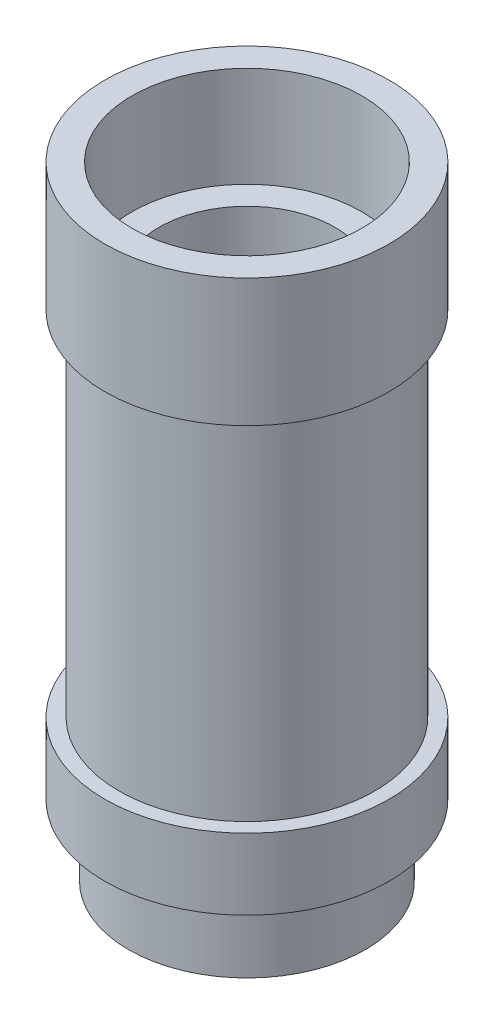
ISO-10303-21;
HEADER;
FILE_DESCRIPTION(('STEP AP214'),'2;1');
FILE_NAME('part.step','',(''),(''),'','','');
FILE_SCHEMA(('AUTOMOTIVE_DESIGN { 1 0 10303 214 1 1 1 1 }'));
ENDSEC;
DATA;
#1=APPLICATION_CONTEXT('core data for automotive mechanical design processes');
#2=APPLICATION_PROTOCOL_DEFINITION('international standard','automotive_design',2000,#1);
#3=PRODUCT_CONTEXT('',#1,'mechanical');
#4=PRODUCT('Part','Part','',(#3));
#5=PRODUCT_RELATED_PRODUCT_CATEGORY('part','',(#4));
#6=PRODUCT_DEFINITION_FORMATION('','',#4);
#7=PRODUCT_DEFINITION_CONTEXT('part definition',#1,'design');
#8=PRODUCT_DEFINITION('design','',#6,#7);
#9=PRODUCT_DEFINITION_SHAPE('','',#8);
#10=(LENGTH_UNIT() NAMED_UNIT(*) SI_UNIT(.MILLI.,.METRE.));
#11=(NAMED_UNIT(*) PLANE_ANGLE_UNIT() SI_UNIT($,.RADIAN.));
#12=(NAMED_UNIT(*) SI_UNIT($,.STERADIAN.) SOLID_ANGLE_UNIT());
#13=UNCERTAINTY_MEASURE_WITH_UNIT(LENGTH_MEASURE(1.E-05),#10,'distance_accuracy_value','');
#14=(GEOMETRIC_REPRESENTATION_CONTEXT(3) GLOBAL_UNCERTAINTY_ASSIGNED_CONTEXT((#13)) GLOBAL_UNIT_ASSIGNED_CONTEXT((#10,
#11,#12)) REPRESENTATION_CONTEXT('',''));
#15=CARTESIAN_POINT('',(0.,0.,0.));
#16=DIRECTION('',(0.,0.,1.));
#17=DIRECTION('',(1.,0.,0.));
#18=AXIS2_PLACEMENT_3D('',#15,#16,#17);
#19=CARTESIAN_POINT('',(0.,30.,0.));
#20=DIRECTION('',(0.,-1.,0.));
#21=DIRECTION('',(0.,0.,-1.));
#22=AXIS2_PLACEMENT_3D('',#19,#20,#21);
#23=CYLINDRICAL_SURFACE('',#22,50.);
#24=CARTESIAN_POINT('',(0.,30.,0.));
#25=DIRECTION('',(0.,1.,0.));
#26=DIRECTION('',(0.,0.,1.));
#27=AXIS2_PLACEMENT_3D('',#24,#25,#26);
#28=CIRCLE('',#27,50.);
#29=CARTESIAN_POINT('',(0.,30.,50.));
#30=VERTEX_POINT('',#29);
#31=EDGE_CURVE('E51',#30,#30,#28,.T.);
#32=ORIENTED_EDGE('',*,*,#31,.F.);
#33=EDGE_LOOP('',(#32));
#34=FACE_BOUND('',#33,.T.);
#35=CARTESIAN_POINT('',(0.,0.,0.));
#36=DIRECTION('',(0.,1.,0.));
#37=DIRECTION('',(0.,0.,1.));
#38=AXIS2_PLACEMENT_3D('',#35,#36,#37);
#39=CIRCLE('',#38,50.);
#40=CARTESIAN_POINT('',(0.,0.,50.));
#41=VERTEX_POINT('',#40);
#42=EDGE_CURVE('E57',#41,#41,#39,.T.);
#43=ORIENTED_EDGE('',*,*,#42,.T.);
#44=EDGE_LOOP('',(#43));
#45=FACE_BOUND('',#44,.T.);
#46=ADVANCED_FACE('F43',(#34,#45),#23,.T.);
#47=CARTESIAN_POINT('',(0.,0.,0.));
#48=DIRECTION('',(0.,1.,0.));
#49=DIRECTION('',(0.,0.,1.));
#50=AXIS2_PLACEMENT_3D('',#47,#48,#49);
#51=PLANE('',#50);
#52=CARTESIAN_POINT('',(0.,0.,0.));
#53=DIRECTION('',(0.,1.,0.));
#54=DIRECTION('',(0.,0.,1.));
#55=AXIS2_PLACEMENT_3D('',#52,#53,#54);
#56=CIRCLE('',#55,30.);
#57=CARTESIAN_POINT('',(0.,0.,30.));
#58=VERTEX_POINT('',#57);
#59=EDGE_CURVE('E46',#58,#58,#56,.T.);
#60=ORIENTED_EDGE('',*,*,#59,.T.);
#61=EDGE_LOOP('',(#60));
#62=FACE_BOUND('',#61,.T.);
#63=ORIENTED_EDGE('',*,*,#42,.F.);
#64=EDGE_LOOP('',(#63));
#65=FACE_BOUND('',#64,.T.);
#66=ADVANCED_FACE('F122',(#62,#65),#51,.F.);
#67=CARTESIAN_POINT('',(0.,60.,0.));
#68=DIRECTION('',(0.,-1.,0.));
#69=DIRECTION('',(0.,0.,-1.));
#70=AXIS2_PLACEMENT_3D('',#67,#68,#69);
#71=CYLINDRICAL_SURFACE('',#70,60.);
#72=CARTESIAN_POINT('',(0.,60.,0.));
#73=DIRECTION('',(0.,1.,0.));
#74=DIRECTION('',(0.,0.,1.));
#75=AXIS2_PLACEMENT_3D('',#72,#73,#74);
#76=CIRCLE('',#75,60.);
#77=CARTESIAN_POINT('',(0.,60.,60.));
#78=VERTEX_POINT('',#77);
#79=EDGE_CURVE('E63',#78,#78,#76,.T.);
#80=ORIENTED_EDGE('',*,*,#79,.F.);
#81=EDGE_LOOP('',(#80));
#82=FACE_BOUND('',#81,.T.);
#83=CARTESIAN_POINT('',(0.,30.,0.));
#84=DIRECTION('',(0.,1.,0.));
#85=DIRECTION('',(0.,0.,1.));
#86=AXIS2_PLACEMENT_3D('',#83,#84,#85);
#87=CIRCLE('',#86,60.);
#88=CARTESIAN_POINT('',(0.,30.,60.));
#89=VERTEX_POINT('',#88);
#90=EDGE_CURVE('E67',#89,#89,#87,.T.);
#91=ORIENTED_EDGE('',*,*,#90,.T.);
#92=EDGE_LOOP('',(#91));
#93=FACE_BOUND('',#92,.T.);
#94=ADVANCED_FACE('F127',(#82,#93),#71,.T.);
#95=CARTESIAN_POINT('',(0.,60.,0.));
#96=DIRECTION('',(0.,1.,0.));
#97=DIRECTION('',(0.,0.,1.));
#98=AXIS2_PLACEMENT_3D('',#95,#96,#97);
#99=PLANE('',#98);
#100=CARTESIAN_POINT('',(0.,60.,0.));
#101=DIRECTION('',(0.,1.,0.));
#102=DIRECTION('',(0.,0.,1.));
#103=AXIS2_PLACEMENT_3D('',#100,#101,#102);
#104=CIRCLE('',#103,54.);
#105=CARTESIAN_POINT('',(0.,60.,54.));
#106=VERTEX_POINT('',#105);
#107=EDGE_CURVE('E10',#106,#106,#104,.T.);
#108=ORIENTED_EDGE('',*,*,#107,.F.);
#109=EDGE_LOOP('',(#108));
#110=FACE_BOUND('',#109,.T.);
#111=ORIENTED_EDGE('',*,*,#79,.T.);
#112=EDGE_LOOP('',(#111));
#113=FACE_BOUND('',#112,.T.);
#114=ADVANCED_FACE('F138',(#110,#113),#99,.T.);
#115=CARTESIAN_POINT('',(0.,30.,0.));
#116=DIRECTION('',(0.,1.,0.));
#117=DIRECTION('',(0.,0.,1.));
#118=AXIS2_PLACEMENT_3D('',#115,#116,#117);
#119=PLANE('',#118);
#120=ORIENTED_EDGE('',*,*,#31,.T.);
#121=EDGE_LOOP('',(#120));
#122=FACE_BOUND('',#121,.T.);
#123=ORIENTED_EDGE('',*,*,#90,.F.);
#124=EDGE_LOOP('',(#123));
#125=FACE_BOUND('',#124,.T.);
#126=ADVANCED_FACE('F134',(#122,#125),#119,.F.);
#127=CARTESIAN_POINT('',(0.,209.,0.));
#128=DIRECTION('',(0.,-1.,0.));
#129=DIRECTION('',(0.,0.,-1.));
#130=AXIS2_PLACEMENT_3D('',#127,#128,#129);
#131=CYLINDRICAL_SURFACE('',#130,54.);
#132=CARTESIAN_POINT('',(0.,209.,0.));
#133=DIRECTION('',(0.,1.,0.));
#134=DIRECTION('',(0.,0.,1.));
#135=AXIS2_PLACEMENT_3D('',#132,#133,#134);
#136=CIRCLE('',#135,54.);
#137=CARTESIAN_POINT('',(0.,209.,54.));
#138=VERTEX_POINT('',#137);
#139=EDGE_CURVE('E61',#138,#138,#136,.T.);
#140=ORIENTED_EDGE('',*,*,#139,.F.);
#141=EDGE_LOOP('',(#140));
#142=FACE_BOUND('',#141,.T.);
#143=ORIENTED_EDGE('',*,*,#107,.T.);
#144=EDGE_LOOP('',(#143));
#145=FACE_BOUND('',#144,.T.);
#146=ADVANCED_FACE('F137',(#142,#145),#131,.T.);
#147=CARTESIAN_POINT('',(0.,263.,0.));
#148=DIRECTION('',(0.,-1.,0.));
#149=DIRECTION('',(0.,0.,-1.));
#150=AXIS2_PLACEMENT_3D('',#147,#148,#149);
#151=CYLINDRICAL_SURFACE('',#150,60.);
#152=CARTESIAN_POINT('',(0.,263.,0.));
#153=DIRECTION('',(0.,1.,0.));
#154=DIRECTION('',(0.,0.,1.));
#155=AXIS2_PLACEMENT_3D('',#152,#153,#154);
#156=CIRCLE('',#155,60.);
#157=CARTESIAN_POINT('',(0.,263.,60.));
#158=VERTEX_POINT('',#157);
#159=EDGE_CURVE('E94',#158,#158,#156,.T.);
#160=ORIENTED_EDGE('',*,*,#159,.F.);
#161=EDGE_LOOP('',(#160));
#162=FACE_BOUND('',#161,.T.);
#163=CARTESIAN_POINT('',(0.,209.,0.));
#164=DIRECTION('',(0.,1.,0.));
#165=DIRECTION('',(0.,0.,1.));
#166=AXIS2_PLACEMENT_3D('',#163,#164,#165);
#167=CIRCLE('',#166,60.);
#168=CARTESIAN_POINT('',(0.,209.,60.));
#169=VERTEX_POINT('',#168);
#170=EDGE_CURVE('E82',#169,#169,#167,.T.);
#171=ORIENTED_EDGE('',*,*,#170,.T.);
#172=EDGE_LOOP('',(#171));
#173=FACE_BOUND('',#172,.T.);
#174=ADVANCED_FACE('F101',(#162,#173),#151,.T.);
#175=CARTESIAN_POINT('',(0.,263.,0.));
#176=DIRECTION('',(0.,1.,0.));
#177=DIRECTION('',(0.,0.,1.));
#178=AXIS2_PLACEMENT_3D('',#175,#176,#177);
#179=PLANE('',#178);
#180=CARTESIAN_POINT('',(0.,263.,0.));
#181=DIRECTION('',(0.,1.,0.));
#182=DIRECTION('',(0.,0.,1.));
#183=AXIS2_PLACEMENT_3D('',#180,#181,#182);
#184=CIRCLE('',#183,48.5036809097853);
#185=CARTESIAN_POINT('',(0.,263.,48.5036809097853));
#186=VERTEX_POINT('',#185);
#187=EDGE_CURVE('E73',#186,#186,#184,.T.);
#188=ORIENTED_EDGE('',*,*,#187,.F.);
#189=EDGE_LOOP('',(#188));
#190=FACE_BOUND('',#189,.T.);
#191=ORIENTED_EDGE('',*,*,#159,.T.);
#192=EDGE_LOOP('',(#191));
#193=FACE_BOUND('',#192,.T.);
#194=ADVANCED_FACE('F106',(#190,#193),#179,.T.);
#195=CARTESIAN_POINT('',(0.,209.,0.));
#196=DIRECTION('',(0.,1.,0.));
#197=DIRECTION('',(0.,0.,1.));
#198=AXIS2_PLACEMENT_3D('',#195,#196,#197);
#199=PLANE('',#198);
#200=ORIENTED_EDGE('',*,*,#139,.T.);
#201=EDGE_LOOP('',(#200));
#202=FACE_BOUND('',#201,.T.);
#203=ORIENTED_EDGE('',*,*,#170,.F.);
#204=EDGE_LOOP('',(#203));
#205=FACE_BOUND('',#204,.T.);
#206=ADVANCED_FACE('F103',(#202,#205),#199,.F.);
#207=CARTESIAN_POINT('',(0.,273.95824631601,0.));
#208=DIRECTION('',(0.,1.,0.));
#209=DIRECTION('',(0.,0.,1.));
#210=AXIS2_PLACEMENT_3D('',#207,#208,#209);
#211=CYLINDRICAL_SURFACE('',#210,30.);
#212=CARTESIAN_POINT('',(0.,37.5582353810897,0.));
#213=DIRECTION('',(0.,1.,0.));
#214=DIRECTION('',(0.,0.,1.));
#215=AXIS2_PLACEMENT_3D('',#212,#213,#214);
#216=CIRCLE('',#215,30.);
#217=CARTESIAN_POINT('',(0.,37.5582353810897,30.));
#218=VERTEX_POINT('',#217);
#219=EDGE_CURVE('E76',#218,#218,#216,.T.);
#220=ORIENTED_EDGE('',*,*,#219,.T.);
#221=EDGE_LOOP('',(#220));
#222=FACE_BOUND('',#221,.T.);
#223=ORIENTED_EDGE('',*,*,#59,.F.);
#224=EDGE_LOOP('',(#223));
#225=FACE_BOUND('',#224,.T.);
#226=ADVANCED_FACE('F105',(#222,#225),#211,.F.);
#227=CARTESIAN_POINT('',(-30.,37.5582353810897,0.));
#228=DIRECTION('',(0.,-1.,0.));
#229=DIRECTION('',(0.,0.,-1.));
#230=AXIS2_PLACEMENT_3D('',#227,#228,#229);
#231=PLANE('',#230);
#232=ORIENTED_EDGE('',*,*,#219,.F.);
#233=EDGE_LOOP('',(#232));
#234=FACE_BOUND('',#233,.T.);
#235=CARTESIAN_POINT('',(0.,37.5582353810897,0.));
#236=DIRECTION('',(0.,1.,0.));
#237=DIRECTION('',(0.,0.,1.));
#238=AXIS2_PLACEMENT_3D('',#235,#236,#237);
#239=CIRCLE('',#238,48.5036809097853);
#240=CARTESIAN_POINT('',(0.,37.5582353810897,48.5036809097853));
#241=VERTEX_POINT('',#240);
#242=EDGE_CURVE('E84',#241,#241,#239,.T.);
#243=ORIENTED_EDGE('',*,*,#242,.T.);
#244=EDGE_LOOP('',(#243));
#245=FACE_BOUND('',#244,.T.);
#246=ADVANCED_FACE('F114',(#234,#245),#231,.F.);
#247=CARTESIAN_POINT('',(0.,273.95824631601,0.));
#248=DIRECTION('',(0.,1.,0.));
#249=DIRECTION('',(0.,0.,1.));
#250=AXIS2_PLACEMENT_3D('',#247,#248,#249);
#251=CYLINDRICAL_SURFACE('',#250,48.5036809097853);
#252=ORIENTED_EDGE('',*,*,#242,.F.);
#253=EDGE_LOOP('',(#252));
#254=FACE_BOUND('',#253,.T.);
#255=CARTESIAN_POINT('',(0.,51.5582353810897,0.));
#256=DIRECTION('',(0.,1.,0.));
#257=DIRECTION('',(0.,0.,1.));
#258=AXIS2_PLACEMENT_3D('',#255,#256,#257);
#259=CIRCLE('',#258,48.5036809097853);
#260=CARTESIAN_POINT('',(0.,51.5582353810897,48.5036809097853));
#261=VERTEX_POINT('',#260);
#262=EDGE_CURVE('E90',#261,#261,#259,.T.);
#263=ORIENTED_EDGE('',*,*,#262,.T.);
#264=EDGE_LOOP('',(#263));
#265=FACE_BOUND('',#264,.T.);
#266=ADVANCED_FACE('F200',(#254,#265),#251,.F.);
#267=CARTESIAN_POINT('',(-48.5036809097853,51.5582353810897,0.));
#268=DIRECTION('',(0.,1.,0.));
#269=DIRECTION('',(0.,0.,1.));
#270=AXIS2_PLACEMENT_3D('',#267,#268,#269);
#271=PLANE('',#270);
#272=ORIENTED_EDGE('',*,*,#262,.F.);
#273=EDGE_LOOP('',(#272));
#274=FACE_BOUND('',#273,.T.);
#275=CARTESIAN_POINT('',(0.,51.5582353810897,0.));
#276=DIRECTION('',(0.,1.,0.));
#277=DIRECTION('',(0.,0.,1.));
#278=AXIS2_PLACEMENT_3D('',#275,#276,#277);
#279=CIRCLE('',#278,37.1469784008179);
#280=CARTESIAN_POINT('',(0.,51.5582353810897,37.1469784008179));
#281=VERTEX_POINT('',#280);
#282=EDGE_CURVE('E278',#281,#281,#279,.T.);
#283=ORIENTED_EDGE('',*,*,#282,.T.);
#284=EDGE_LOOP('',(#283));
#285=FACE_BOUND('',#284,.T.);
#286=ADVANCED_FACE('F209',(#274,#285),#271,.F.);
#287=CARTESIAN_POINT('',(0.,273.95824631601,0.));
#288=DIRECTION('',(0.,1.,0.));
#289=DIRECTION('',(0.,0.,1.));
#290=AXIS2_PLACEMENT_3D('',#287,#288,#289);
#291=CYLINDRICAL_SURFACE('',#290,37.1469784008179);
#292=ORIENTED_EDGE('',*,*,#282,.F.);
#293=EDGE_LOOP('',(#292));
#294=FACE_BOUND('',#293,.T.);
#295=CARTESIAN_POINT('',(0.,220.582243691629,0.));
#296=DIRECTION('',(0.,1.,0.));
#297=DIRECTION('',(0.,0.,1.));
#298=AXIS2_PLACEMENT_3D('',#295,#296,#297);
#299=CIRCLE('',#298,37.1469784008179);
#300=CARTESIAN_POINT('',(0.,220.582243691629,37.1469784008179));
#301=VERTEX_POINT('',#300);
#302=EDGE_CURVE('E274',#301,#301,#299,.T.);
#303=ORIENTED_EDGE('',*,*,#302,.T.);
#304=EDGE_LOOP('',(#303));
#305=FACE_BOUND('',#304,.T.);
#306=ADVANCED_FACE('F218',(#294,#305),#291,.F.);
#307=CARTESIAN_POINT('',(-37.1469784008179,220.582243691629,0.));
#308=DIRECTION('',(0.,-1.,0.));
#309=DIRECTION('',(0.,0.,-1.));
#310=AXIS2_PLACEMENT_3D('',#307,#308,#309);
#311=PLANE('',#310);
#312=ORIENTED_EDGE('',*,*,#302,.F.);
#313=EDGE_LOOP('',(#312));
#314=FACE_BOUND('',#313,.T.);
#315=CARTESIAN_POINT('',(0.,220.582243691629,0.));
#316=DIRECTION('',(0.,1.,0.));
#317=DIRECTION('',(0.,0.,1.));
#318=AXIS2_PLACEMENT_3D('',#315,#316,#317);
#319=CIRCLE('',#318,48.5036809097853);
#320=CARTESIAN_POINT('',(0.,220.582243691629,48.5036809097853));
#321=VERTEX_POINT('',#320);
#322=EDGE_CURVE('E271',#321,#321,#319,.T.);
#323=ORIENTED_EDGE('',*,*,#322,.T.);
#324=EDGE_LOOP('',(#323));
#325=FACE_BOUND('',#324,.T.);
#326=ADVANCED_FACE('F227',(#314,#325),#311,.F.);
#327=CARTESIAN_POINT('',(0.,273.95824631601,0.));
#328=DIRECTION('',(0.,1.,0.));
#329=DIRECTION('',(0.,0.,1.));
#330=AXIS2_PLACEMENT_3D('',#327,#328,#329);
#331=CYLINDRICAL_SURFACE('',#330,48.5036809097853);
#332=ORIENTED_EDGE('',*,*,#187,.T.);
#333=EDGE_LOOP('',(#332));
#334=FACE_BOUND('',#333,.T.);
#335=ORIENTED_EDGE('',*,*,#322,.F.);
#336=EDGE_LOOP('',(#335));
#337=FACE_BOUND('',#336,.T.);
#338=ADVANCED_FACE('F236',(#334,#337),#331,.F.);
#339=CLOSED_SHELL('',(#46,#66,#94,#114,#126,#146,#174,#194,#206,#226,#246,#266,#286,#306,#326,#338));
#340=MANIFOLD_SOLID_BREP('B2',#339);
#341=ADVANCED_BREP_SHAPE_REPRESENTATION('',(#18,#340),#14);
#342=SHAPE_DEFINITION_REPRESENTATION(#9,#341);
ENDSEC;
END-ISO-10303-21;
